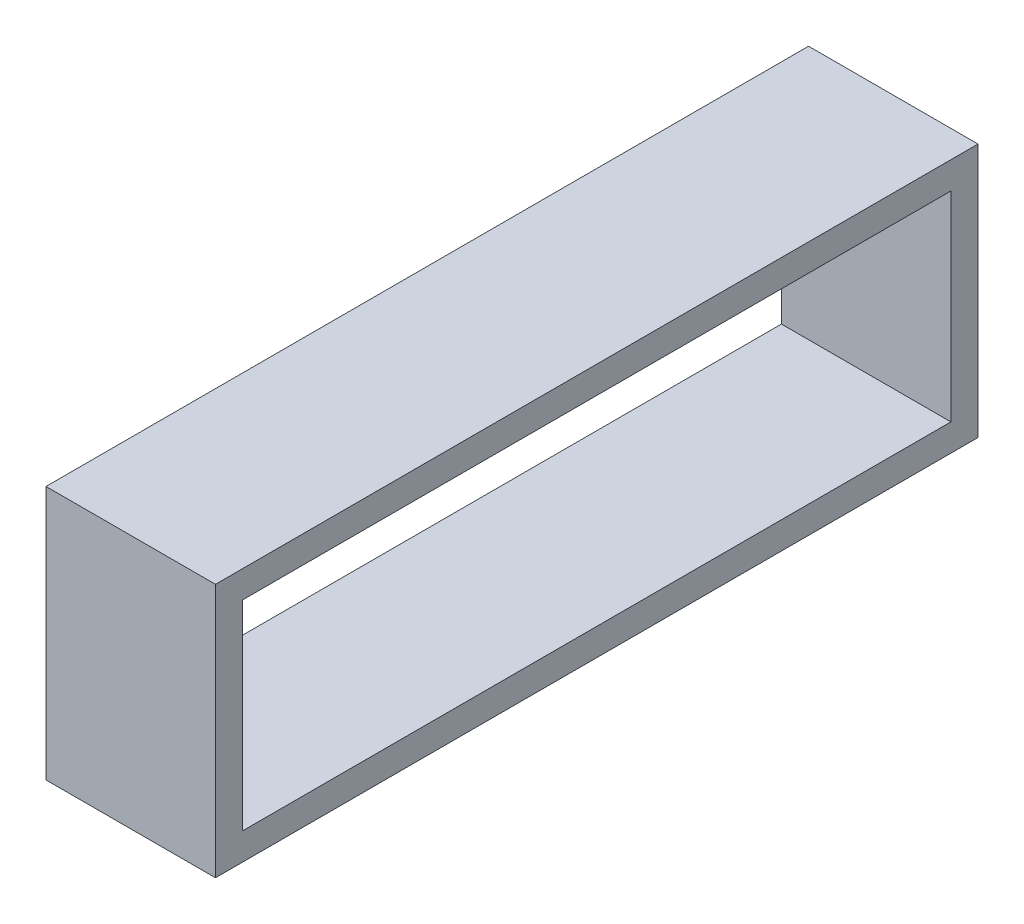
ISO-10303-21;
HEADER;
FILE_DESCRIPTION(('STEP AP214'),'2;1');
FILE_NAME('part.step','',(''),(''),'','','');
FILE_SCHEMA(('AUTOMOTIVE_DESIGN { 1 0 10303 214 1 1 1 1 }'));
ENDSEC;
DATA;
#1=APPLICATION_CONTEXT('core data for automotive mechanical design processes');
#2=APPLICATION_PROTOCOL_DEFINITION('international standard','automotive_design',2000,#1);
#3=PRODUCT_CONTEXT('',#1,'mechanical');
#4=PRODUCT('Part','Part','',(#3));
#5=PRODUCT_RELATED_PRODUCT_CATEGORY('part','',(#4));
#6=PRODUCT_DEFINITION_FORMATION('','',#4);
#7=PRODUCT_DEFINITION_CONTEXT('part definition',#1,'design');
#8=PRODUCT_DEFINITION('design','',#6,#7);
#9=PRODUCT_DEFINITION_SHAPE('','',#8);
#10=(LENGTH_UNIT() NAMED_UNIT(*) SI_UNIT(.MILLI.,.METRE.));
#11=(NAMED_UNIT(*) PLANE_ANGLE_UNIT() SI_UNIT($,.RADIAN.));
#12=(NAMED_UNIT(*) SI_UNIT($,.STERADIAN.) SOLID_ANGLE_UNIT());
#13=UNCERTAINTY_MEASURE_WITH_UNIT(LENGTH_MEASURE(1.E-05),#10,'distance_accuracy_value','');
#14=(GEOMETRIC_REPRESENTATION_CONTEXT(3) GLOBAL_UNCERTAINTY_ASSIGNED_CONTEXT((#13)) GLOBAL_UNIT_ASSIGNED_CONTEXT((#10,
#11,#12)) REPRESENTATION_CONTEXT('',''));
#15=CARTESIAN_POINT('',(0.,0.,0.));
#16=DIRECTION('',(0.,0.,1.));
#17=DIRECTION('',(1.,0.,0.));
#18=AXIS2_PLACEMENT_3D('',#15,#16,#17);
#19=CARTESIAN_POINT('',(0.,0.,57.15));
#20=DIRECTION('',(0.,-1.,0.));
#21=DIRECTION('',(0.,0.,-1.));
#22=AXIS2_PLACEMENT_3D('',#19,#20,#21);
#23=PLANE('',#22);
#24=DIRECTION('',(-1.,0.,0.));
#25=VECTOR('',#24,1.);
#26=CARTESIAN_POINT('',(0.,0.,0.));
#27=LINE('',#26,#25);
#28=CARTESIAN_POINT('',(6.34999999999999,0.,0.));
#29=VERTEX_POINT('',#28);
#30=CARTESIAN_POINT('',(-6.34999999999999,0.,0.));
#31=VERTEX_POINT('',#30);
#32=EDGE_CURVE('E138',#29,#31,#27,.T.);
#33=ORIENTED_EDGE('',*,*,#32,.T.);
#34=DIRECTION('',(0.,0.,-1.));
#35=VECTOR('',#34,1.);
#36=CARTESIAN_POINT('',(-6.34999999999999,0.,57.15));
#37=LINE('',#36,#35);
#38=CARTESIAN_POINT('',(-6.34999999999999,0.,57.15));
#39=VERTEX_POINT('',#38);
#40=EDGE_CURVE('E182',#39,#31,#37,.T.);
#41=ORIENTED_EDGE('',*,*,#40,.F.);
#42=DIRECTION('',(-1.,0.,0.));
#43=VECTOR('',#42,1.);
#44=CARTESIAN_POINT('',(0.,0.,57.15));
#45=LINE('',#44,#43);
#46=CARTESIAN_POINT('',(6.34999999999999,0.,57.15));
#47=VERTEX_POINT('',#46);
#48=EDGE_CURVE('E143',#47,#39,#45,.T.);
#49=ORIENTED_EDGE('',*,*,#48,.F.);
#50=DIRECTION('',(0.,0.,-1.));
#51=VECTOR('',#50,1.);
#52=CARTESIAN_POINT('',(6.34999999999999,0.,57.15));
#53=LINE('',#52,#51);
#54=EDGE_CURVE('E159',#47,#29,#53,.T.);
#55=ORIENTED_EDGE('',*,*,#54,.T.);
#56=EDGE_LOOP('',(#33,#41,#49,#55));
#57=FACE_BOUND('',#56,.T.);
#58=ADVANCED_FACE('F43',(#57),#23,.F.);
#59=CARTESIAN_POINT('',(-6.34999999999999,0.,57.15));
#60=DIRECTION('',(1.,0.,0.));
#61=DIRECTION('',(0.,0.,-1.));
#62=AXIS2_PLACEMENT_3D('',#59,#60,#61);
#63=PLANE('',#62);
#64=DIRECTION('',(0.,0.,1.));
#65=VECTOR('',#64,1.);
#66=CARTESIAN_POINT('',(-6.34999999999998,-17.018,2.032));
#67=LINE('',#66,#65);
#68=CARTESIAN_POINT('',(-6.34999999999999,-17.018,2.03200000000001));
#69=VERTEX_POINT('',#68);
#70=CARTESIAN_POINT('',(-6.34999999999998,-17.018,55.118));
#71=VERTEX_POINT('',#70);
#72=EDGE_CURVE('E120',#69,#71,#67,.T.);
#73=ORIENTED_EDGE('',*,*,#72,.F.);
#74=DIRECTION('',(0.,-1.,0.));
#75=VECTOR('',#74,1.);
#76=CARTESIAN_POINT('',(-6.34999999999999,-2.03200000000002,2.032));
#77=LINE('',#76,#75);
#78=CARTESIAN_POINT('',(-6.34999999999999,-2.03200000000002,2.032));
#79=VERTEX_POINT('',#78);
#80=EDGE_CURVE('E58',#79,#69,#77,.T.);
#81=ORIENTED_EDGE('',*,*,#80,.F.);
#82=DIRECTION('',(0.,0.,-1.));
#83=VECTOR('',#82,1.);
#84=CARTESIAN_POINT('',(-6.34999999999999,-2.03200000000002,2.032));
#85=LINE('',#84,#83);
#86=CARTESIAN_POINT('',(-6.34999999999999,-2.03200000000002,55.118));
#87=VERTEX_POINT('',#86);
#88=EDGE_CURVE('E128',#87,#79,#85,.T.);
#89=ORIENTED_EDGE('',*,*,#88,.F.);
#90=DIRECTION('',(0.,1.,0.));
#91=VECTOR('',#90,1.);
#92=CARTESIAN_POINT('',(-6.34999999999999,-2.03200000000002,55.118));
#93=LINE('',#92,#91);
#94=EDGE_CURVE('E110',#71,#87,#93,.T.);
#95=ORIENTED_EDGE('',*,*,#94,.F.);
#96=EDGE_LOOP('',(#73,#81,#89,#95));
#97=FACE_BOUND('',#96,.T.);
#98=DIRECTION('',(0.,-1.,0.));
#99=VECTOR('',#98,1.);
#100=CARTESIAN_POINT('',(-6.34999999999999,0.,0.));
#101=LINE('',#100,#99);
#102=CARTESIAN_POINT('',(-6.34999999999999,-19.05,0.));
#103=VERTEX_POINT('',#102);
#104=EDGE_CURVE('E163',#31,#103,#101,.T.);
#105=ORIENTED_EDGE('',*,*,#104,.T.);
#106=DIRECTION('',(0.,0.,-1.));
#107=VECTOR('',#106,1.);
#108=CARTESIAN_POINT('',(-6.34999999999999,-19.05,57.15));
#109=LINE('',#108,#107);
#110=CARTESIAN_POINT('',(-6.34999999999999,-19.05,57.15));
#111=VERTEX_POINT('',#110);
#112=EDGE_CURVE('E179',#111,#103,#109,.T.);
#113=ORIENTED_EDGE('',*,*,#112,.F.);
#114=DIRECTION('',(0.,-1.,0.));
#115=VECTOR('',#114,1.);
#116=CARTESIAN_POINT('',(-6.34999999999999,0.,57.15));
#117=LINE('',#116,#115);
#118=EDGE_CURVE('E147',#39,#111,#117,.T.);
#119=ORIENTED_EDGE('',*,*,#118,.F.);
#120=ORIENTED_EDGE('',*,*,#40,.T.);
#121=EDGE_LOOP('',(#105,#113,#119,#120));
#122=FACE_BOUND('',#121,.T.);
#123=ADVANCED_FACE('F125',(#97,#122),#63,.F.);
#124=CARTESIAN_POINT('',(0.,-19.05,57.15));
#125=DIRECTION('',(0.,-1.,0.));
#126=DIRECTION('',(0.,0.,-1.));
#127=AXIS2_PLACEMENT_3D('',#124,#125,#126);
#128=PLANE('',#127);
#129=DIRECTION('',(-1.,0.,0.));
#130=VECTOR('',#129,1.);
#131=CARTESIAN_POINT('',(0.,-19.05,0.));
#132=LINE('',#131,#130);
#133=CARTESIAN_POINT('',(6.34999999999999,-19.05,0.));
#134=VERTEX_POINT('',#133);
#135=EDGE_CURVE('E167',#134,#103,#132,.T.);
#136=ORIENTED_EDGE('',*,*,#135,.F.);
#137=DIRECTION('',(0.,0.,-1.));
#138=VECTOR('',#137,1.);
#139=CARTESIAN_POINT('',(6.34999999999999,-19.05,57.15));
#140=LINE('',#139,#138);
#141=CARTESIAN_POINT('',(6.34999999999999,-19.05,57.15));
#142=VERTEX_POINT('',#141);
#143=EDGE_CURVE('E176',#142,#134,#140,.T.);
#144=ORIENTED_EDGE('',*,*,#143,.F.);
#145=DIRECTION('',(-1.,0.,0.));
#146=VECTOR('',#145,1.);
#147=CARTESIAN_POINT('',(0.,-19.05,57.15));
#148=LINE('',#147,#146);
#149=EDGE_CURVE('E151',#142,#111,#148,.T.);
#150=ORIENTED_EDGE('',*,*,#149,.T.);
#151=ORIENTED_EDGE('',*,*,#112,.T.);
#152=EDGE_LOOP('',(#136,#144,#150,#151));
#153=FACE_BOUND('',#152,.T.);
#154=ADVANCED_FACE('F219',(#153),#128,.T.);
#155=CARTESIAN_POINT('',(6.34999999999999,0.,57.15));
#156=DIRECTION('',(1.,0.,0.));
#157=DIRECTION('',(0.,0.,-1.));
#158=AXIS2_PLACEMENT_3D('',#155,#156,#157);
#159=PLANE('',#158);
#160=DIRECTION('',(0.,1.,0.));
#161=VECTOR('',#160,1.);
#162=CARTESIAN_POINT('',(6.34999999999999,0.,2.032));
#163=LINE('',#162,#161);
#164=CARTESIAN_POINT('',(6.35000000000002,-17.018,2.032));
#165=VERTEX_POINT('',#164);
#166=CARTESIAN_POINT('',(6.35000000000002,-2.03200000000002,2.032));
#167=VERTEX_POINT('',#166);
#168=EDGE_CURVE('E11',#165,#167,#163,.T.);
#169=ORIENTED_EDGE('',*,*,#168,.F.);
#170=DIRECTION('',(0.,0.,-1.));
#171=VECTOR('',#170,1.);
#172=CARTESIAN_POINT('',(6.34999999999999,-17.018,57.15));
#173=LINE('',#172,#171);
#174=CARTESIAN_POINT('',(6.34999999999999,-17.018,55.118));
#175=VERTEX_POINT('',#174);
#176=EDGE_CURVE('E186',#175,#165,#173,.T.);
#177=ORIENTED_EDGE('',*,*,#176,.F.);
#178=DIRECTION('',(0.,-1.,0.));
#179=VECTOR('',#178,1.);
#180=CARTESIAN_POINT('',(6.34999999999999,0.,55.118));
#181=LINE('',#180,#179);
#182=CARTESIAN_POINT('',(6.35000000000002,-2.03200000000002,55.118));
#183=VERTEX_POINT('',#182);
#184=EDGE_CURVE('E113',#183,#175,#181,.T.);
#185=ORIENTED_EDGE('',*,*,#184,.F.);
#186=DIRECTION('',(0.,0.,1.));
#187=VECTOR('',#186,1.);
#188=CARTESIAN_POINT('',(6.34999999999999,-2.03200000000002,57.15));
#189=LINE('',#188,#187);
#190=EDGE_CURVE('E51',#167,#183,#189,.T.);
#191=ORIENTED_EDGE('',*,*,#190,.F.);
#192=EDGE_LOOP('',(#169,#177,#185,#191));
#193=FACE_BOUND('',#192,.T.);
#194=DIRECTION('',(0.,-1.,0.));
#195=VECTOR('',#194,1.);
#196=CARTESIAN_POINT('',(6.34999999999999,0.,0.));
#197=LINE('',#196,#195);
#198=EDGE_CURVE('E148',#29,#134,#197,.T.);
#199=ORIENTED_EDGE('',*,*,#198,.F.);
#200=ORIENTED_EDGE('',*,*,#54,.F.);
#201=DIRECTION('',(0.,-1.,0.));
#202=VECTOR('',#201,1.);
#203=CARTESIAN_POINT('',(6.34999999999999,0.,57.15));
#204=LINE('',#203,#202);
#205=EDGE_CURVE('E155',#47,#142,#204,.T.);
#206=ORIENTED_EDGE('',*,*,#205,.T.);
#207=ORIENTED_EDGE('',*,*,#143,.T.);
#208=EDGE_LOOP('',(#199,#200,#206,#207));
#209=FACE_BOUND('',#208,.T.);
#210=ADVANCED_FACE('F197',(#193,#209),#159,.T.);
#211=CARTESIAN_POINT('',(0.,0.,57.15));
#212=DIRECTION('',(0.,0.,1.));
#213=DIRECTION('',(1.,0.,0.));
#214=AXIS2_PLACEMENT_3D('',#211,#212,#213);
#215=PLANE('',#214);
#216=ORIENTED_EDGE('',*,*,#48,.T.);
#217=ORIENTED_EDGE('',*,*,#118,.T.);
#218=ORIENTED_EDGE('',*,*,#149,.F.);
#219=ORIENTED_EDGE('',*,*,#205,.F.);
#220=EDGE_LOOP('',(#216,#217,#218,#219));
#221=FACE_BOUND('',#220,.T.);
#222=ADVANCED_FACE('F209',(#221),#215,.T.);
#223=CARTESIAN_POINT('',(0.,0.,0.));
#224=DIRECTION('',(0.,0.,1.));
#225=DIRECTION('',(1.,0.,0.));
#226=AXIS2_PLACEMENT_3D('',#223,#224,#225);
#227=PLANE('',#226);
#228=ORIENTED_EDGE('',*,*,#32,.F.);
#229=ORIENTED_EDGE('',*,*,#198,.T.);
#230=ORIENTED_EDGE('',*,*,#135,.T.);
#231=ORIENTED_EDGE('',*,*,#104,.F.);
#232=EDGE_LOOP('',(#228,#229,#230,#231));
#233=FACE_BOUND('',#232,.T.);
#234=ADVANCED_FACE('F202',(#233),#227,.F.);
#235=CARTESIAN_POINT('',(118.11,-2.03199999999999,2.032));
#236=DIRECTION('',(0.,0.,-1.));
#237=DIRECTION('',(0.,1.,0.));
#238=AXIS2_PLACEMENT_3D('',#235,#236,#237);
#239=PLANE('',#238);
#240=ORIENTED_EDGE('',*,*,#168,.T.);
#241=DIRECTION('',(-1.,0.,0.));
#242=VECTOR('',#241,1.);
#243=CARTESIAN_POINT('',(118.11,-2.03199999999999,2.032));
#244=LINE('',#243,#242);
#245=EDGE_CURVE('E135',#167,#79,#244,.T.);
#246=ORIENTED_EDGE('',*,*,#245,.T.);
#247=ORIENTED_EDGE('',*,*,#80,.T.);
#248=DIRECTION('',(-1.,0.,0.));
#249=VECTOR('',#248,1.);
#250=CARTESIAN_POINT('',(118.11,-17.018,2.032));
#251=LINE('',#250,#249);
#252=EDGE_CURVE('E117',#165,#69,#251,.T.);
#253=ORIENTED_EDGE('',*,*,#252,.F.);
#254=EDGE_LOOP('',(#240,#246,#247,#253));
#255=FACE_BOUND('',#254,.T.);
#256=ADVANCED_FACE('F199',(#255),#239,.F.);
#257=CARTESIAN_POINT('',(118.11,-2.03199999999999,2.032));
#258=DIRECTION('',(0.,1.,0.));
#259=DIRECTION('',(-1.,0.,0.));
#260=AXIS2_PLACEMENT_3D('',#257,#258,#259);
#261=PLANE('',#260);
#262=ORIENTED_EDGE('',*,*,#190,.T.);
#263=DIRECTION('',(-1.,0.,0.));
#264=VECTOR('',#263,1.);
#265=CARTESIAN_POINT('',(118.11,-2.03199999999999,55.118));
#266=LINE('',#265,#264);
#267=EDGE_CURVE('E116',#183,#87,#266,.T.);
#268=ORIENTED_EDGE('',*,*,#267,.T.);
#269=ORIENTED_EDGE('',*,*,#88,.T.);
#270=ORIENTED_EDGE('',*,*,#245,.F.);
#271=EDGE_LOOP('',(#262,#268,#269,#270));
#272=FACE_BOUND('',#271,.T.);
#273=ADVANCED_FACE('F194',(#272),#261,.F.);
#274=CARTESIAN_POINT('',(118.11,-2.03199999999999,55.118));
#275=DIRECTION('',(0.,0.,1.));
#276=DIRECTION('',(1.,0.,0.));
#277=AXIS2_PLACEMENT_3D('',#274,#275,#276);
#278=PLANE('',#277);
#279=ORIENTED_EDGE('',*,*,#184,.T.);
#280=DIRECTION('',(-1.,0.,0.));
#281=VECTOR('',#280,1.);
#282=CARTESIAN_POINT('',(118.11,-17.018,55.118));
#283=LINE('',#282,#281);
#284=EDGE_CURVE('E66',#175,#71,#283,.T.);
#285=ORIENTED_EDGE('',*,*,#284,.T.);
#286=ORIENTED_EDGE('',*,*,#94,.T.);
#287=ORIENTED_EDGE('',*,*,#267,.F.);
#288=EDGE_LOOP('',(#279,#285,#286,#287));
#289=FACE_BOUND('',#288,.T.);
#290=ADVANCED_FACE('F107',(#289),#278,.F.);
#291=CARTESIAN_POINT('',(118.11,-17.018,2.032));
#292=DIRECTION('',(0.,-1.,0.));
#293=DIRECTION('',(1.,0.,0.));
#294=AXIS2_PLACEMENT_3D('',#291,#292,#293);
#295=PLANE('',#294);
#296=ORIENTED_EDGE('',*,*,#176,.T.);
#297=ORIENTED_EDGE('',*,*,#252,.T.);
#298=ORIENTED_EDGE('',*,*,#72,.T.);
#299=ORIENTED_EDGE('',*,*,#284,.F.);
#300=EDGE_LOOP('',(#296,#297,#298,#299));
#301=FACE_BOUND('',#300,.T.);
#302=ADVANCED_FACE('F121',(#301),#295,.F.);
#303=CLOSED_SHELL('',(#58,#123,#154,#210,#222,#234,#256,#273,#290,#302));
#304=MANIFOLD_SOLID_BREP('B2',#303);
#305=ADVANCED_BREP_SHAPE_REPRESENTATION('',(#18,#304),#14);
#306=SHAPE_DEFINITION_REPRESENTATION(#9,#305);
ENDSEC;
END-ISO-10303-21;
